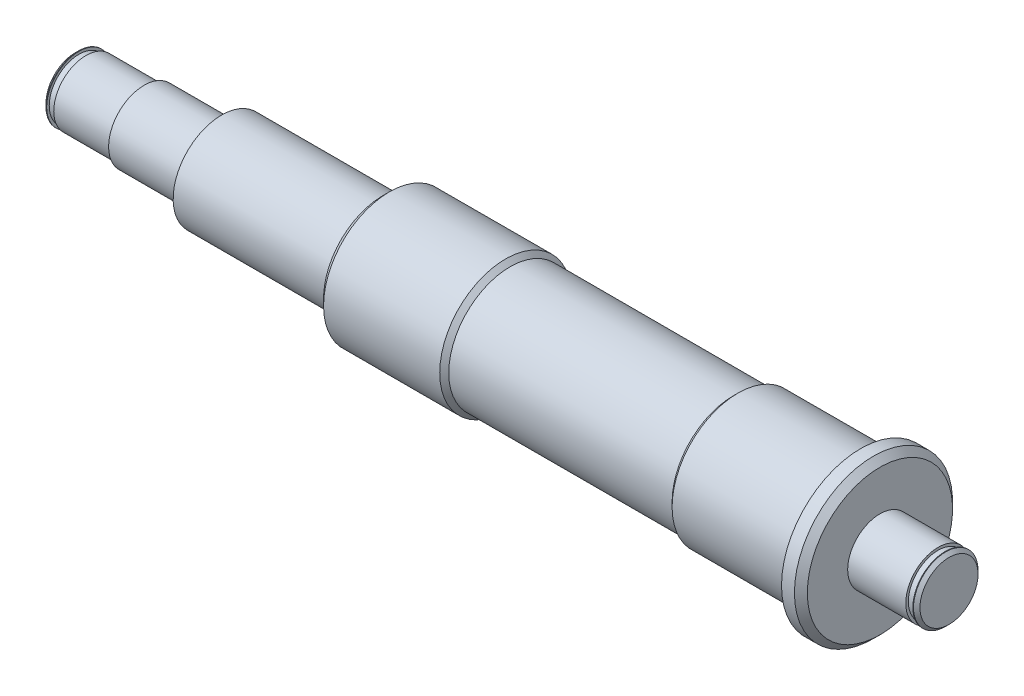
ISO-10303-21;
HEADER;
FILE_DESCRIPTION(('STEP AP214'),'2;1');
FILE_NAME('part.step','',(''),(''),'','','');
FILE_SCHEMA(('AUTOMOTIVE_DESIGN { 1 0 10303 214 1 1 1 1 }'));
ENDSEC;
DATA;
#1=APPLICATION_CONTEXT('core data for automotive mechanical design processes');
#2=APPLICATION_PROTOCOL_DEFINITION('international standard','automotive_design',2000,#1);
#3=PRODUCT_CONTEXT('',#1,'mechanical');
#4=PRODUCT('Part','Part','',(#3));
#5=PRODUCT_RELATED_PRODUCT_CATEGORY('part','',(#4));
#6=PRODUCT_DEFINITION_FORMATION('','',#4);
#7=PRODUCT_DEFINITION_CONTEXT('part definition',#1,'design');
#8=PRODUCT_DEFINITION('design','',#6,#7);
#9=PRODUCT_DEFINITION_SHAPE('','',#8);
#10=(LENGTH_UNIT() NAMED_UNIT(*) SI_UNIT(.MILLI.,.METRE.));
#11=(NAMED_UNIT(*) PLANE_ANGLE_UNIT() SI_UNIT($,.RADIAN.));
#12=(NAMED_UNIT(*) SI_UNIT($,.STERADIAN.) SOLID_ANGLE_UNIT());
#13=UNCERTAINTY_MEASURE_WITH_UNIT(LENGTH_MEASURE(1.E-05),#10,'distance_accuracy_value','');
#14=(GEOMETRIC_REPRESENTATION_CONTEXT(3) GLOBAL_UNCERTAINTY_ASSIGNED_CONTEXT((#13)) GLOBAL_UNIT_ASSIGNED_CONTEXT((#10,
#11,#12)) REPRESENTATION_CONTEXT('',''));
#15=CARTESIAN_POINT('',(0.,0.,0.));
#16=DIRECTION('',(0.,0.,1.));
#17=DIRECTION('',(1.,0.,0.));
#18=AXIS2_PLACEMENT_3D('',#15,#16,#17);
#19=CARTESIAN_POINT('',(0.,0.,0.));
#20=DIRECTION('',(1.,0.,0.));
#21=DIRECTION('',(0.,0.,-1.));
#22=AXIS2_PLACEMENT_3D('',#19,#20,#21);
#23=PLANE('',#22);
#24=CARTESIAN_POINT('',(0.,0.,0.));
#25=DIRECTION('',(1.,0.,0.));
#26=DIRECTION('',(0.,0.,-1.));
#27=AXIS2_PLACEMENT_3D('',#24,#25,#26);
#28=CIRCLE('',#27,4.50000000000003);
#29=CARTESIAN_POINT('',(0.,0.,-4.50000000000003));
#30=VERTEX_POINT('',#29);
#31=EDGE_CURVE('E58',#30,#30,#28,.F.);
#32=ORIENTED_EDGE('',*,*,#31,.T.);
#33=EDGE_LOOP('',(#32));
#34=FACE_BOUND('',#33,.T.);
#35=ADVANCED_FACE('F48',(#34),#23,.F.);
#36=CARTESIAN_POINT('',(-10.6746561027708,0.,0.));
#37=DIRECTION('',(-1.,0.,0.));
#38=DIRECTION('',(0.,0.,1.));
#39=AXIS2_PLACEMENT_3D('',#36,#37,#38);
#40=CYLINDRICAL_SURFACE('',#39,5.);
#41=CARTESIAN_POINT('',(0.499999999999973,0.,0.));
#42=DIRECTION('',(1.,0.,0.));
#43=DIRECTION('',(0.,0.,-1.));
#44=AXIS2_PLACEMENT_3D('',#41,#42,#43);
#45=CIRCLE('',#44,5.);
#46=CARTESIAN_POINT('',(0.499999999999973,0.,-5.));
#47=VERTEX_POINT('',#46);
#48=EDGE_CURVE('E12',#47,#47,#45,.T.);
#49=ORIENTED_EDGE('',*,*,#48,.T.);
#50=EDGE_LOOP('',(#49));
#51=FACE_BOUND('',#50,.T.);
#52=CARTESIAN_POINT('',(0.600000000000003,0.,0.));
#53=DIRECTION('',(-1.,0.,0.));
#54=DIRECTION('',(0.,0.,1.));
#55=AXIS2_PLACEMENT_3D('',#52,#53,#54);
#56=CIRCLE('',#55,5.);
#57=CARTESIAN_POINT('',(0.600000000000003,0.,5.));
#58=VERTEX_POINT('',#57);
#59=EDGE_CURVE('E130',#58,#58,#56,.T.);
#60=ORIENTED_EDGE('',*,*,#59,.T.);
#61=EDGE_LOOP('',(#60));
#62=FACE_BOUND('',#61,.T.);
#63=ADVANCED_FACE('F191',(#51,#62),#40,.T.);
#64=CARTESIAN_POINT('',(0.600000000000003,5.,0.));
#65=DIRECTION('',(-1.,0.,0.));
#66=DIRECTION('',(0.,0.,1.));
#67=AXIS2_PLACEMENT_3D('',#64,#65,#66);
#68=PLANE('',#67);
#69=ORIENTED_EDGE('',*,*,#59,.F.);
#70=EDGE_LOOP('',(#69));
#71=FACE_BOUND('',#70,.T.);
#72=CARTESIAN_POINT('',(0.600000000000003,0.,0.));
#73=DIRECTION('',(-1.,0.,0.));
#74=DIRECTION('',(0.,0.,1.));
#75=AXIS2_PLACEMENT_3D('',#72,#73,#74);
#76=CIRCLE('',#75,4.6);
#77=CARTESIAN_POINT('',(0.600000000000003,0.,4.6));
#78=VERTEX_POINT('',#77);
#79=EDGE_CURVE('E126',#78,#78,#76,.T.);
#80=ORIENTED_EDGE('',*,*,#79,.T.);
#81=EDGE_LOOP('',(#80));
#82=FACE_BOUND('',#81,.T.);
#83=ADVANCED_FACE('F196',(#71,#82),#68,.F.);
#84=CARTESIAN_POINT('',(-10.6746561027708,0.,0.));
#85=DIRECTION('',(-1.,0.,0.));
#86=DIRECTION('',(0.,0.,1.));
#87=AXIS2_PLACEMENT_3D('',#84,#85,#86);
#88=CYLINDRICAL_SURFACE('',#87,4.6);
#89=ORIENTED_EDGE('',*,*,#79,.F.);
#90=EDGE_LOOP('',(#89));
#91=FACE_BOUND('',#90,.T.);
#92=CARTESIAN_POINT('',(1.69999999999999,0.,0.));
#93=DIRECTION('',(-1.,0.,0.));
#94=DIRECTION('',(0.,0.,1.));
#95=AXIS2_PLACEMENT_3D('',#92,#93,#94);
#96=CIRCLE('',#95,4.6);
#97=CARTESIAN_POINT('',(1.69999999999999,0.,4.6));
#98=VERTEX_POINT('',#97);
#99=EDGE_CURVE('E122',#98,#98,#96,.T.);
#100=ORIENTED_EDGE('',*,*,#99,.T.);
#101=EDGE_LOOP('',(#100));
#102=FACE_BOUND('',#101,.T.);
#103=ADVANCED_FACE('F271',(#91,#102),#88,.T.);
#104=CARTESIAN_POINT('',(1.69999999999999,4.6,0.));
#105=DIRECTION('',(1.,0.,0.));
#106=DIRECTION('',(0.,0.,-1.));
#107=AXIS2_PLACEMENT_3D('',#104,#105,#106);
#108=PLANE('',#107);
#109=ORIENTED_EDGE('',*,*,#99,.F.);
#110=EDGE_LOOP('',(#109));
#111=FACE_BOUND('',#110,.T.);
#112=CARTESIAN_POINT('',(1.69999999999999,0.,0.));
#113=DIRECTION('',(-1.,0.,0.));
#114=DIRECTION('',(0.,0.,1.));
#115=AXIS2_PLACEMENT_3D('',#112,#113,#114);
#116=CIRCLE('',#115,5.);
#117=CARTESIAN_POINT('',(1.69999999999999,0.,5.));
#118=VERTEX_POINT('',#117);
#119=EDGE_CURVE('E118',#118,#118,#116,.T.);
#120=ORIENTED_EDGE('',*,*,#119,.T.);
#121=EDGE_LOOP('',(#120));
#122=FACE_BOUND('',#121,.T.);
#123=ADVANCED_FACE('F267',(#111,#122),#108,.F.);
#124=CARTESIAN_POINT('',(-10.6746561027708,0.,0.));
#125=DIRECTION('',(-1.,0.,0.));
#126=DIRECTION('',(0.,0.,1.));
#127=AXIS2_PLACEMENT_3D('',#124,#125,#126);
#128=CYLINDRICAL_SURFACE('',#127,5.);
#129=ORIENTED_EDGE('',*,*,#119,.F.);
#130=EDGE_LOOP('',(#129));
#131=FACE_BOUND('',#130,.T.);
#132=CARTESIAN_POINT('',(10.7,0.,0.));
#133=DIRECTION('',(-1.,0.,0.));
#134=DIRECTION('',(0.,0.,1.));
#135=AXIS2_PLACEMENT_3D('',#132,#133,#134);
#136=CIRCLE('',#135,5.);
#137=CARTESIAN_POINT('',(10.7,0.,5.));
#138=VERTEX_POINT('',#137);
#139=EDGE_CURVE('E114',#138,#138,#136,.T.);
#140=ORIENTED_EDGE('',*,*,#139,.T.);
#141=EDGE_LOOP('',(#140));
#142=FACE_BOUND('',#141,.T.);
#143=ADVANCED_FACE('F263',(#131,#142),#128,.T.);
#144=CARTESIAN_POINT('',(10.7,5.,0.));
#145=DIRECTION('',(1.,0.,0.));
#146=DIRECTION('',(0.,0.,-1.));
#147=AXIS2_PLACEMENT_3D('',#144,#145,#146);
#148=PLANE('',#147);
#149=ORIENTED_EDGE('',*,*,#139,.F.);
#150=EDGE_LOOP('',(#149));
#151=FACE_BOUND('',#150,.T.);
#152=CARTESIAN_POINT('',(10.7,0.,0.));
#153=DIRECTION('',(-1.,0.,0.));
#154=DIRECTION('',(0.,0.,1.));
#155=AXIS2_PLACEMENT_3D('',#152,#153,#154);
#156=CIRCLE('',#155,5.5);
#157=CARTESIAN_POINT('',(10.7,0.,5.5));
#158=VERTEX_POINT('',#157);
#159=EDGE_CURVE('E110',#158,#158,#156,.T.);
#160=ORIENTED_EDGE('',*,*,#159,.T.);
#161=EDGE_LOOP('',(#160));
#162=FACE_BOUND('',#161,.T.);
#163=ADVANCED_FACE('F259',(#151,#162),#148,.F.);
#164=CARTESIAN_POINT('',(-10.6746561027708,0.,0.));
#165=DIRECTION('',(-1.,0.,0.));
#166=DIRECTION('',(0.,0.,1.));
#167=AXIS2_PLACEMENT_3D('',#164,#165,#166);
#168=CYLINDRICAL_SURFACE('',#167,5.5);
#169=ORIENTED_EDGE('',*,*,#159,.F.);
#170=EDGE_LOOP('',(#169));
#171=FACE_BOUND('',#170,.T.);
#172=CARTESIAN_POINT('',(22.7,0.,0.));
#173=DIRECTION('',(-1.,0.,0.));
#174=DIRECTION('',(0.,0.,1.));
#175=AXIS2_PLACEMENT_3D('',#172,#173,#174);
#176=CIRCLE('',#175,5.5);
#177=CARTESIAN_POINT('',(22.7,0.,5.5));
#178=VERTEX_POINT('',#177);
#179=EDGE_CURVE('E100',#178,#178,#176,.T.);
#180=ORIENTED_EDGE('',*,*,#179,.T.);
#181=EDGE_LOOP('',(#180));
#182=FACE_BOUND('',#181,.T.);
#183=ADVANCED_FACE('F255',(#171,#182),#168,.T.);
#184=CARTESIAN_POINT('',(22.7,7.5,0.));
#185=DIRECTION('',(1.,0.,0.));
#186=DIRECTION('',(0.,0.,-1.));
#187=AXIS2_PLACEMENT_3D('',#184,#185,#186);
#188=PLANE('',#187);
#189=ORIENTED_EDGE('',*,*,#179,.F.);
#190=EDGE_LOOP('',(#189));
#191=FACE_BOUND('',#190,.T.);
#192=CARTESIAN_POINT('',(22.7,0.,0.));
#193=DIRECTION('',(-1.,0.,0.));
#194=DIRECTION('',(0.,0.,1.));
#195=AXIS2_PLACEMENT_3D('',#192,#193,#194);
#196=CIRCLE('',#195,7.5);
#197=CARTESIAN_POINT('',(22.7,-6.,4.5));
#198=VERTEX_POINT('',#197);
#199=CARTESIAN_POINT('',(22.7,-6.,-4.5));
#200=VERTEX_POINT('',#199);
#201=EDGE_CURVE('E88',#198,#200,#196,.T.);
#202=ORIENTED_EDGE('',*,*,#201,.T.);
#203=DIRECTION('',(0.,0.,-1.));
#204=VECTOR('',#203,1.);
#205=CARTESIAN_POINT('',(22.7,-6.,4.5));
#206=LINE('',#205,#204);
#207=EDGE_CURVE('E81',#198,#200,#206,.T.);
#208=ORIENTED_EDGE('',*,*,#207,.F.);
#209=EDGE_LOOP('',(#202,#208));
#210=FACE_BOUND('',#209,.T.);
#211=ADVANCED_FACE('F249',(#191,#210),#188,.F.);
#212=CARTESIAN_POINT('',(-10.6746561027708,0.,0.));
#213=DIRECTION('',(-1.,0.,0.));
#214=DIRECTION('',(0.,0.,1.));
#215=AXIS2_PLACEMENT_3D('',#212,#213,#214);
#216=CYLINDRICAL_SURFACE('',#215,7.5);
#217=CARTESIAN_POINT('',(47.7,0.,0.));
#218=DIRECTION('',(-1.,0.,0.));
#219=DIRECTION('',(0.,0.,1.));
#220=AXIS2_PLACEMENT_3D('',#217,#218,#219);
#221=CIRCLE('',#220,7.5);
#222=CARTESIAN_POINT('',(47.7,-6.,4.5));
#223=VERTEX_POINT('',#222);
#224=CARTESIAN_POINT('',(47.7,-6.,-4.5));
#225=VERTEX_POINT('',#224);
#226=EDGE_CURVE('E86',#223,#225,#221,.T.);
#227=ORIENTED_EDGE('',*,*,#226,.T.);
#228=DIRECTION('',(-1.,0.,0.));
#229=VECTOR('',#228,1.);
#230=CARTESIAN_POINT('',(56.8241437954473,-6.,-4.5));
#231=LINE('',#230,#229);
#232=EDGE_CURVE('E78',#225,#200,#231,.T.);
#233=ORIENTED_EDGE('',*,*,#232,.T.);
#234=ORIENTED_EDGE('',*,*,#201,.F.);
#235=DIRECTION('',(-1.,0.,0.));
#236=VECTOR('',#235,1.);
#237=CARTESIAN_POINT('',(56.8241437954473,-6.,4.5));
#238=LINE('',#237,#236);
#239=EDGE_CURVE('E72',#223,#198,#238,.T.);
#240=ORIENTED_EDGE('',*,*,#239,.F.);
#241=EDGE_LOOP('',(#227,#233,#234,#240));
#242=FACE_BOUND('',#241,.T.);
#243=ADVANCED_FACE('F85',(#242),#216,.T.);
#244=CARTESIAN_POINT('',(47.7,7.5,0.));
#245=DIRECTION('',(1.,0.,0.));
#246=DIRECTION('',(0.,0.,-1.));
#247=AXIS2_PLACEMENT_3D('',#244,#245,#246);
#248=PLANE('',#247);
#249=CARTESIAN_POINT('',(47.7,0.,0.));
#250=DIRECTION('',(1.,0.,0.));
#251=DIRECTION('',(0.,0.,-1.));
#252=AXIS2_PLACEMENT_3D('',#249,#250,#251);
#253=CIRCLE('',#252,9.20000000000001);
#254=CARTESIAN_POINT('',(47.7,0.,-9.20000000000001));
#255=VERTEX_POINT('',#254);
#256=EDGE_CURVE('E154',#255,#255,#253,.F.);
#257=ORIENTED_EDGE('',*,*,#256,.T.);
#258=EDGE_LOOP('',(#257));
#259=FACE_BOUND('',#258,.T.);
#260=ORIENTED_EDGE('',*,*,#226,.F.);
#261=DIRECTION('',(0.,0.,-1.));
#262=VECTOR('',#261,1.);
#263=CARTESIAN_POINT('',(47.7,-6.,4.5));
#264=LINE('',#263,#262);
#265=EDGE_CURVE('E64',#223,#225,#264,.T.);
#266=ORIENTED_EDGE('',*,*,#265,.T.);
#267=EDGE_LOOP('',(#260,#266));
#268=FACE_BOUND('',#267,.T.);
#269=ADVANCED_FACE('F92',(#259,#268),#248,.F.);
#270=CARTESIAN_POINT('',(-10.6746561027708,0.,0.));
#271=DIRECTION('',(-1.,0.,0.));
#272=DIRECTION('',(0.,0.,1.));
#273=AXIS2_PLACEMENT_3D('',#270,#271,#272);
#274=CYLINDRICAL_SURFACE('',#273,10.2);
#275=CARTESIAN_POINT('',(66.7,0.,0.));
#276=DIRECTION('',(-1.,0.,0.));
#277=DIRECTION('',(0.,0.,1.));
#278=AXIS2_PLACEMENT_3D('',#275,#276,#277);
#279=CIRCLE('',#278,10.2);
#280=CARTESIAN_POINT('',(66.7,0.,10.2));
#281=VERTEX_POINT('',#280);
#282=EDGE_CURVE('E142',#281,#281,#279,.T.);
#283=ORIENTED_EDGE('',*,*,#282,.T.);
#284=EDGE_LOOP('',(#283));
#285=FACE_BOUND('',#284,.T.);
#286=CARTESIAN_POINT('',(48.7,0.,0.));
#287=DIRECTION('',(1.,0.,0.));
#288=DIRECTION('',(0.,0.,-1.));
#289=AXIS2_PLACEMENT_3D('',#286,#287,#288);
#290=CIRCLE('',#289,10.2);
#291=CARTESIAN_POINT('',(48.7,0.,-10.2));
#292=VERTEX_POINT('',#291);
#293=EDGE_CURVE('E138',#292,#292,#290,.T.);
#294=ORIENTED_EDGE('',*,*,#293,.T.);
#295=EDGE_LOOP('',(#294));
#296=FACE_BOUND('',#295,.T.);
#297=ADVANCED_FACE('F240',(#285,#296),#274,.T.);
#298=CARTESIAN_POINT('',(-10.6746561027708,0.,0.));
#299=DIRECTION('',(-1.,0.,0.));
#300=DIRECTION('',(0.,0.,1.));
#301=AXIS2_PLACEMENT_3D('',#298,#299,#300);
#302=CYLINDRICAL_SURFACE('',#301,9.5);
#303=CARTESIAN_POINT('',(67.4,0.,0.));
#304=DIRECTION('',(-1.,0.,0.));
#305=DIRECTION('',(0.,0.,1.));
#306=AXIS2_PLACEMENT_3D('',#303,#304,#305);
#307=CIRCLE('',#306,9.5);
#308=CARTESIAN_POINT('',(67.4,0.,9.5));
#309=VERTEX_POINT('',#308);
#310=EDGE_CURVE('E162',#309,#309,#307,.F.);
#311=ORIENTED_EDGE('',*,*,#310,.T.);
#312=EDGE_LOOP('',(#311));
#313=FACE_BOUND('',#312,.T.);
#314=CARTESIAN_POINT('',(102.,0.,0.));
#315=DIRECTION('',(1.,0.,0.));
#316=DIRECTION('',(0.,0.,-1.));
#317=AXIS2_PLACEMENT_3D('',#314,#315,#316);
#318=CIRCLE('',#317,9.5);
#319=CARTESIAN_POINT('',(102.,0.,-9.5));
#320=VERTEX_POINT('',#319);
#321=EDGE_CURVE('E158',#320,#320,#318,.F.);
#322=ORIENTED_EDGE('',*,*,#321,.T.);
#323=EDGE_LOOP('',(#322));
#324=FACE_BOUND('',#323,.T.);
#325=ADVANCED_FACE('F246',(#313,#324),#302,.T.);
#326=CARTESIAN_POINT('',(-10.6746561027708,0.,0.));
#327=DIRECTION('',(-1.,0.,0.));
#328=DIRECTION('',(0.,0.,1.));
#329=AXIS2_PLACEMENT_3D('',#326,#327,#328);
#330=CYLINDRICAL_SURFACE('',#329,10.2);
#331=CARTESIAN_POINT('',(102.7,0.,0.));
#332=DIRECTION('',(1.,0.,0.));
#333=DIRECTION('',(0.,0.,-1.));
#334=AXIS2_PLACEMENT_3D('',#331,#332,#333);
#335=CIRCLE('',#334,10.2);
#336=CARTESIAN_POINT('',(102.7,0.,-10.2));
#337=VERTEX_POINT('',#336);
#338=EDGE_CURVE('E134',#337,#337,#335,.T.);
#339=ORIENTED_EDGE('',*,*,#338,.T.);
#340=EDGE_LOOP('',(#339));
#341=FACE_BOUND('',#340,.T.);
#342=CARTESIAN_POINT('',(121.7,0.,0.));
#343=DIRECTION('',(-1.,0.,0.));
#344=DIRECTION('',(0.,0.,1.));
#345=AXIS2_PLACEMENT_3D('',#342,#343,#344);
#346=CIRCLE('',#345,10.2);
#347=CARTESIAN_POINT('',(121.7,0.,10.2));
#348=VERTEX_POINT('',#347);
#349=EDGE_CURVE('E94',#348,#348,#346,.T.);
#350=ORIENTED_EDGE('',*,*,#349,.T.);
#351=EDGE_LOOP('',(#350));
#352=FACE_BOUND('',#351,.T.);
#353=ADVANCED_FACE('F336',(#341,#352),#330,.T.);
#354=CARTESIAN_POINT('',(121.7,10.2,0.));
#355=DIRECTION('',(1.,0.,0.));
#356=DIRECTION('',(0.,0.,-1.));
#357=AXIS2_PLACEMENT_3D('',#354,#355,#356);
#358=PLANE('',#357);
#359=ORIENTED_EDGE('',*,*,#349,.F.);
#360=EDGE_LOOP('',(#359));
#361=FACE_BOUND('',#360,.T.);
#362=CARTESIAN_POINT('',(121.7,0.,0.));
#363=DIRECTION('',(-1.,0.,0.));
#364=DIRECTION('',(0.,0.,1.));
#365=AXIS2_PLACEMENT_3D('',#362,#363,#364);
#366=CIRCLE('',#365,12.25);
#367=CARTESIAN_POINT('',(121.7,0.,12.25));
#368=VERTEX_POINT('',#367);
#369=EDGE_CURVE('E103',#368,#368,#366,.T.);
#370=ORIENTED_EDGE('',*,*,#369,.T.);
#371=EDGE_LOOP('',(#370));
#372=FACE_BOUND('',#371,.T.);
#373=ADVANCED_FACE('F322',(#361,#372),#358,.F.);
#374=CARTESIAN_POINT('',(-10.6746561027708,0.,0.));
#375=DIRECTION('',(-1.,0.,0.));
#376=DIRECTION('',(0.,0.,1.));
#377=AXIS2_PLACEMENT_3D('',#374,#375,#376);
#378=CYLINDRICAL_SURFACE('',#377,12.25);
#379=CARTESIAN_POINT('',(123.7,0.,0.));
#380=DIRECTION('',(-1.,0.,0.));
#381=DIRECTION('',(0.,0.,1.));
#382=AXIS2_PLACEMENT_3D('',#379,#380,#381);
#383=CIRCLE('',#382,12.25);
#384=CARTESIAN_POINT('',(123.7,0.,12.25));
#385=VERTEX_POINT('',#384);
#386=EDGE_CURVE('E146',#385,#385,#383,.T.);
#387=ORIENTED_EDGE('',*,*,#386,.T.);
#388=EDGE_LOOP('',(#387));
#389=FACE_BOUND('',#388,.T.);
#390=ORIENTED_EDGE('',*,*,#369,.F.);
#391=EDGE_LOOP('',(#390));
#392=FACE_BOUND('',#391,.T.);
#393=ADVANCED_FACE('F324',(#389,#392),#378,.T.);
#394=CARTESIAN_POINT('',(124.7,12.25,0.));
#395=DIRECTION('',(-1.,0.,0.));
#396=DIRECTION('',(0.,0.,1.));
#397=AXIS2_PLACEMENT_3D('',#394,#395,#396);
#398=PLANE('',#397);
#399=CARTESIAN_POINT('',(124.7,0.,0.));
#400=DIRECTION('',(-1.,0.,0.));
#401=DIRECTION('',(0.,0.,1.));
#402=AXIS2_PLACEMENT_3D('',#399,#400,#401);
#403=CIRCLE('',#402,11.25);
#404=CARTESIAN_POINT('',(124.7,0.,11.25));
#405=VERTEX_POINT('',#404);
#406=EDGE_CURVE('E150',#405,#405,#403,.F.);
#407=ORIENTED_EDGE('',*,*,#406,.T.);
#408=EDGE_LOOP('',(#407));
#409=FACE_BOUND('',#408,.T.);
#410=CARTESIAN_POINT('',(124.7,0.,0.));
#411=DIRECTION('',(-1.,0.,0.));
#412=DIRECTION('',(0.,0.,1.));
#413=AXIS2_PLACEMENT_3D('',#410,#411,#412);
#414=CIRCLE('',#413,5.);
#415=CARTESIAN_POINT('',(124.7,0.,5.));
#416=VERTEX_POINT('',#415);
#417=EDGE_CURVE('E314',#416,#416,#414,.T.);
#418=ORIENTED_EDGE('',*,*,#417,.T.);
#419=EDGE_LOOP('',(#418));
#420=FACE_BOUND('',#419,.T.);
#421=ADVANCED_FACE('F326',(#409,#420),#398,.F.);
#422=CARTESIAN_POINT('',(-10.6746561027708,0.,0.));
#423=DIRECTION('',(-1.,0.,0.));
#424=DIRECTION('',(0.,0.,1.));
#425=AXIS2_PLACEMENT_3D('',#422,#423,#424);
#426=CYLINDRICAL_SURFACE('',#425,5.);
#427=ORIENTED_EDGE('',*,*,#417,.F.);
#428=EDGE_LOOP('',(#427));
#429=FACE_BOUND('',#428,.T.);
#430=CARTESIAN_POINT('',(133.7,0.,0.));
#431=DIRECTION('',(-1.,0.,0.));
#432=DIRECTION('',(0.,0.,1.));
#433=AXIS2_PLACEMENT_3D('',#430,#431,#432);
#434=CIRCLE('',#433,5.);
#435=CARTESIAN_POINT('',(133.7,0.,5.));
#436=VERTEX_POINT('',#435);
#437=EDGE_CURVE('E310',#436,#436,#434,.T.);
#438=ORIENTED_EDGE('',*,*,#437,.T.);
#439=EDGE_LOOP('',(#438));
#440=FACE_BOUND('',#439,.T.);
#441=ADVANCED_FACE('F333',(#429,#440),#426,.T.);
#442=CARTESIAN_POINT('',(133.7,5.,0.));
#443=DIRECTION('',(-1.,0.,0.));
#444=DIRECTION('',(0.,0.,1.));
#445=AXIS2_PLACEMENT_3D('',#442,#443,#444);
#446=PLANE('',#445);
#447=ORIENTED_EDGE('',*,*,#437,.F.);
#448=EDGE_LOOP('',(#447));
#449=FACE_BOUND('',#448,.T.);
#450=CARTESIAN_POINT('',(133.7,0.,0.));
#451=DIRECTION('',(-1.,0.,0.));
#452=DIRECTION('',(0.,0.,1.));
#453=AXIS2_PLACEMENT_3D('',#450,#451,#452);
#454=CIRCLE('',#453,4.6);
#455=CARTESIAN_POINT('',(133.7,0.,4.6));
#456=VERTEX_POINT('',#455);
#457=EDGE_CURVE('E306',#456,#456,#454,.T.);
#458=ORIENTED_EDGE('',*,*,#457,.T.);
#459=EDGE_LOOP('',(#458));
#460=FACE_BOUND('',#459,.T.);
#461=ADVANCED_FACE('F383',(#449,#460),#446,.F.);
#462=CARTESIAN_POINT('',(-10.6746561027708,0.,0.));
#463=DIRECTION('',(-1.,0.,0.));
#464=DIRECTION('',(0.,0.,1.));
#465=AXIS2_PLACEMENT_3D('',#462,#463,#464);
#466=CYLINDRICAL_SURFACE('',#465,4.6);
#467=ORIENTED_EDGE('',*,*,#457,.F.);
#468=EDGE_LOOP('',(#467));
#469=FACE_BOUND('',#468,.T.);
#470=CARTESIAN_POINT('',(134.8,0.,0.));
#471=DIRECTION('',(-1.,0.,0.));
#472=DIRECTION('',(0.,0.,1.));
#473=AXIS2_PLACEMENT_3D('',#470,#471,#472);
#474=CIRCLE('',#473,4.6);
#475=CARTESIAN_POINT('',(134.8,0.,4.6));
#476=VERTEX_POINT('',#475);
#477=EDGE_CURVE('E302',#476,#476,#474,.T.);
#478=ORIENTED_EDGE('',*,*,#477,.T.);
#479=EDGE_LOOP('',(#478));
#480=FACE_BOUND('',#479,.T.);
#481=ADVANCED_FACE('F392',(#469,#480),#466,.T.);
#482=CARTESIAN_POINT('',(134.8,4.6,0.));
#483=DIRECTION('',(1.,0.,0.));
#484=DIRECTION('',(0.,0.,-1.));
#485=AXIS2_PLACEMENT_3D('',#482,#483,#484);
#486=PLANE('',#485);
#487=ORIENTED_EDGE('',*,*,#477,.F.);
#488=EDGE_LOOP('',(#487));
#489=FACE_BOUND('',#488,.T.);
#490=CARTESIAN_POINT('',(134.8,0.,0.));
#491=DIRECTION('',(-1.,0.,0.));
#492=DIRECTION('',(0.,0.,1.));
#493=AXIS2_PLACEMENT_3D('',#490,#491,#492);
#494=CIRCLE('',#493,5.);
#495=CARTESIAN_POINT('',(134.8,0.,5.));
#496=VERTEX_POINT('',#495);
#497=EDGE_CURVE('E90',#496,#496,#494,.T.);
#498=ORIENTED_EDGE('',*,*,#497,.T.);
#499=EDGE_LOOP('',(#498));
#500=FACE_BOUND('',#499,.T.);
#501=ADVANCED_FACE('F402',(#489,#500),#486,.F.);
#502=CARTESIAN_POINT('',(-10.6746561027708,0.,0.));
#503=DIRECTION('',(-1.,0.,0.));
#504=DIRECTION('',(0.,0.,1.));
#505=AXIS2_PLACEMENT_3D('',#502,#503,#504);
#506=CYLINDRICAL_SURFACE('',#505,5.);
#507=CARTESIAN_POINT('',(134.9,0.,0.));
#508=DIRECTION('',(-1.,0.,0.));
#509=DIRECTION('',(0.,0.,1.));
#510=AXIS2_PLACEMENT_3D('',#507,#508,#509);
#511=CIRCLE('',#510,5.);
#512=CARTESIAN_POINT('',(134.9,0.,5.));
#513=VERTEX_POINT('',#512);
#514=EDGE_CURVE('E166',#513,#513,#511,.T.);
#515=ORIENTED_EDGE('',*,*,#514,.T.);
#516=EDGE_LOOP('',(#515));
#517=FACE_BOUND('',#516,.T.);
#518=ORIENTED_EDGE('',*,*,#497,.F.);
#519=EDGE_LOOP('',(#518));
#520=FACE_BOUND('',#519,.T.);
#521=ADVANCED_FACE('F412',(#517,#520),#506,.T.);
#522=CARTESIAN_POINT('',(135.4,5.,0.));
#523=DIRECTION('',(-1.,0.,0.));
#524=DIRECTION('',(0.,0.,1.));
#525=AXIS2_PLACEMENT_3D('',#522,#523,#524);
#526=PLANE('',#525);
#527=CARTESIAN_POINT('',(135.4,0.,0.));
#528=DIRECTION('',(-1.,0.,0.));
#529=DIRECTION('',(0.,0.,1.));
#530=AXIS2_PLACEMENT_3D('',#527,#528,#529);
#531=CIRCLE('',#530,4.49999999999998);
#532=CARTESIAN_POINT('',(135.4,0.,4.49999999999998));
#533=VERTEX_POINT('',#532);
#534=EDGE_CURVE('E170',#533,#533,#531,.F.);
#535=ORIENTED_EDGE('',*,*,#534,.T.);
#536=EDGE_LOOP('',(#535));
#537=FACE_BOUND('',#536,.T.);
#538=ADVANCED_FACE('F209',(#537),#526,.F.);
#539=CARTESIAN_POINT('',(101.7,0.,0.));
#540=DIRECTION('',(1.,0.,0.));
#541=DIRECTION('',(0.,0.,-1.));
#542=AXIS2_PLACEMENT_3D('',#539,#540,#541);
#543=CONICAL_SURFACE('',#542,9.19999999999998,0.785398163397457);
#544=ORIENTED_EDGE('',*,*,#338,.F.);
#545=EDGE_LOOP('',(#544));
#546=FACE_BOUND('',#545,.T.);
#547=ORIENTED_EDGE('',*,*,#321,.F.);
#548=EDGE_LOOP('',(#547));
#549=FACE_BOUND('',#548,.T.);
#550=ADVANCED_FACE('F202',(#546,#549),#543,.T.);
#551=CARTESIAN_POINT('',(66.7,0.,0.));
#552=DIRECTION('',(-1.,0.,0.));
#553=DIRECTION('',(0.,0.,1.));
#554=AXIS2_PLACEMENT_3D('',#551,#552,#553);
#555=CONICAL_SURFACE('',#554,10.2,0.785398163397445);
#556=ORIENTED_EDGE('',*,*,#310,.F.);
#557=EDGE_LOOP('',(#556));
#558=FACE_BOUND('',#557,.T.);
#559=ORIENTED_EDGE('',*,*,#282,.F.);
#560=EDGE_LOOP('',(#559));
#561=FACE_BOUND('',#560,.T.);
#562=ADVANCED_FACE('F208',(#558,#561),#555,.T.);
#563=CARTESIAN_POINT('',(123.7,0.,0.));
#564=DIRECTION('',(-1.,0.,0.));
#565=DIRECTION('',(0.,0.,1.));
#566=AXIS2_PLACEMENT_3D('',#563,#564,#565);
#567=CONICAL_SURFACE('',#566,12.25,0.785398163397436);
#568=ORIENTED_EDGE('',*,*,#406,.F.);
#569=EDGE_LOOP('',(#568));
#570=FACE_BOUND('',#569,.T.);
#571=ORIENTED_EDGE('',*,*,#386,.F.);
#572=EDGE_LOOP('',(#571));
#573=FACE_BOUND('',#572,.T.);
#574=ADVANCED_FACE('F216',(#570,#573),#567,.T.);
#575=CARTESIAN_POINT('',(47.7,0.,0.));
#576=DIRECTION('',(1.,0.,0.));
#577=DIRECTION('',(0.,0.,-1.));
#578=AXIS2_PLACEMENT_3D('',#575,#576,#577);
#579=CONICAL_SURFACE('',#578,9.2,0.785398163397448);
#580=ORIENTED_EDGE('',*,*,#293,.F.);
#581=EDGE_LOOP('',(#580));
#582=FACE_BOUND('',#581,.T.);
#583=ORIENTED_EDGE('',*,*,#256,.F.);
#584=EDGE_LOOP('',(#583));
#585=FACE_BOUND('',#584,.T.);
#586=ADVANCED_FACE('F187',(#582,#585),#579,.T.);
#587=CARTESIAN_POINT('',(134.9,0.,0.));
#588=DIRECTION('',(-1.,0.,0.));
#589=DIRECTION('',(0.,0.,1.));
#590=AXIS2_PLACEMENT_3D('',#587,#588,#589);
#591=CONICAL_SURFACE('',#590,5.,0.785398163397472);
#592=ORIENTED_EDGE('',*,*,#534,.F.);
#593=EDGE_LOOP('',(#592));
#594=FACE_BOUND('',#593,.T.);
#595=ORIENTED_EDGE('',*,*,#514,.F.);
#596=EDGE_LOOP('',(#595));
#597=FACE_BOUND('',#596,.T.);
#598=ADVANCED_FACE('F180',(#594,#597),#591,.T.);
#599=CARTESIAN_POINT('',(0.,0.,0.));
#600=DIRECTION('',(1.,0.,0.));
#601=DIRECTION('',(0.,0.,-1.));
#602=AXIS2_PLACEMENT_3D('',#599,#600,#601);
#603=CONICAL_SURFACE('',#602,4.50000000000003,0.785398163397444);
#604=ORIENTED_EDGE('',*,*,#48,.F.);
#605=EDGE_LOOP('',(#604));
#606=FACE_BOUND('',#605,.T.);
#607=ORIENTED_EDGE('',*,*,#31,.F.);
#608=EDGE_LOOP('',(#607));
#609=FACE_BOUND('',#608,.T.);
#610=ADVANCED_FACE('F51',(#606,#609),#603,.T.);
#611=CARTESIAN_POINT('',(56.8241437954473,-6.,4.5));
#612=DIRECTION('',(0.,1.,0.));
#613=DIRECTION('',(0.,0.,1.));
#614=AXIS2_PLACEMENT_3D('',#611,#612,#613);
#615=PLANE('',#614);
#616=ORIENTED_EDGE('',*,*,#239,.T.);
#617=ORIENTED_EDGE('',*,*,#207,.T.);
#618=ORIENTED_EDGE('',*,*,#232,.F.);
#619=ORIENTED_EDGE('',*,*,#265,.F.);
#620=EDGE_LOOP('',(#616,#617,#618,#619));
#621=FACE_BOUND('',#620,.T.);
#622=ADVANCED_FACE('F76',(#621),#615,.F.);
#623=CLOSED_SHELL('',(#35,#63,#83,#103,#123,#143,#163,#183,#211,#243,#269,#297,#325,#353,#373,
#393,#421,#441,#461,#481,#501,#521,#538,#550,#562,#574,#586,#598,#610,#622));
#624=MANIFOLD_SOLID_BREP('B2',#623);
#625=ADVANCED_BREP_SHAPE_REPRESENTATION('',(#18,#624),#14);
#626=SHAPE_DEFINITION_REPRESENTATION(#9,#625);
ENDSEC;
END-ISO-10303-21;
